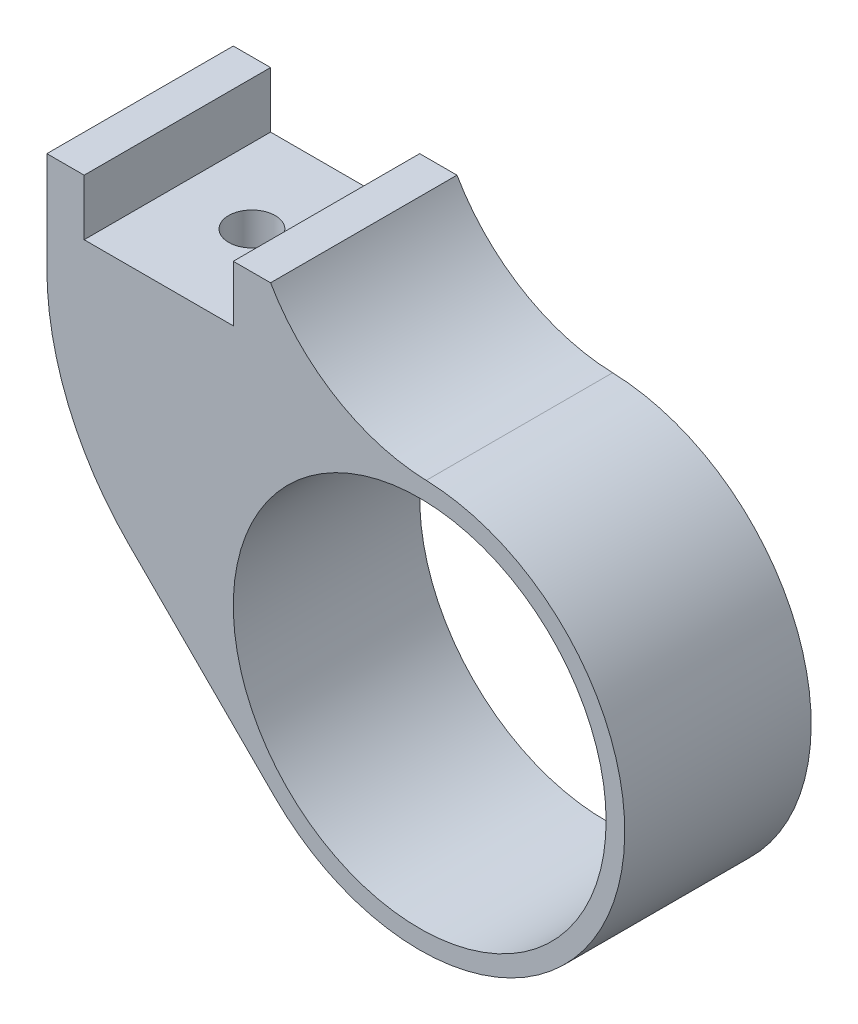
ISO-10303-21;
HEADER;
FILE_DESCRIPTION(('STEP AP214'),'2;1');
FILE_NAME('part.step','',(''),(''),'','','');
FILE_SCHEMA(('AUTOMOTIVE_DESIGN { 1 0 10303 214 1 1 1 1 }'));
ENDSEC;
DATA;
#1=APPLICATION_CONTEXT('core data for automotive mechanical design processes');
#2=APPLICATION_PROTOCOL_DEFINITION('international standard','automotive_design',2000,#1);
#3=PRODUCT_CONTEXT('',#1,'mechanical');
#4=PRODUCT('Part','Part','',(#3));
#5=PRODUCT_RELATED_PRODUCT_CATEGORY('part','',(#4));
#6=PRODUCT_DEFINITION_FORMATION('','',#4);
#7=PRODUCT_DEFINITION_CONTEXT('part definition',#1,'design');
#8=PRODUCT_DEFINITION('design','',#6,#7);
#9=PRODUCT_DEFINITION_SHAPE('','',#8);
#10=(LENGTH_UNIT() NAMED_UNIT(*) SI_UNIT(.MILLI.,.METRE.));
#11=(NAMED_UNIT(*) PLANE_ANGLE_UNIT() SI_UNIT($,.RADIAN.));
#12=(NAMED_UNIT(*) SI_UNIT($,.STERADIAN.) SOLID_ANGLE_UNIT());
#13=UNCERTAINTY_MEASURE_WITH_UNIT(LENGTH_MEASURE(1.E-05),#10,'distance_accuracy_value','');
#14=(GEOMETRIC_REPRESENTATION_CONTEXT(3) GLOBAL_UNCERTAINTY_ASSIGNED_CONTEXT((#13)) GLOBAL_UNIT_ASSIGNED_CONTEXT((#10,
#11,#12)) REPRESENTATION_CONTEXT('',''));
#15=CARTESIAN_POINT('',(0.,0.,0.));
#16=DIRECTION('',(0.,0.,1.));
#17=DIRECTION('',(1.,0.,0.));
#18=AXIS2_PLACEMENT_3D('',#15,#16,#17);
#19=CARTESIAN_POINT('',(0.,13.,10.));
#20=DIRECTION('',(0.,-1.,0.));
#21=DIRECTION('',(1.,0.,0.));
#22=AXIS2_PLACEMENT_3D('',#19,#20,#21);
#23=PLANE('',#22);
#24=DIRECTION('',(-1.,0.,0.));
#25=VECTOR('',#24,1.);
#26=CARTESIAN_POINT('',(0.,13.,0.));
#27=LINE('',#26,#25);
#28=CARTESIAN_POINT('',(-10.,13.,0.));
#29=VERTEX_POINT('',#28);
#30=CARTESIAN_POINT('',(-18.,13.,0.));
#31=VERTEX_POINT('',#30);
#32=EDGE_CURVE('E178',#29,#31,#27,.T.);
#33=ORIENTED_EDGE('',*,*,#32,.T.);
#34=DIRECTION('',(0.,0.,-1.));
#35=VECTOR('',#34,1.);
#36=CARTESIAN_POINT('',(-18.,13.,10.));
#37=LINE('',#36,#35);
#38=CARTESIAN_POINT('',(-18.,13.,10.));
#39=VERTEX_POINT('',#38);
#40=EDGE_CURVE('E191',#39,#31,#37,.T.);
#41=ORIENTED_EDGE('',*,*,#40,.F.);
#42=DIRECTION('',(-1.,0.,0.));
#43=VECTOR('',#42,1.);
#44=CARTESIAN_POINT('',(0.,13.,10.));
#45=LINE('',#44,#43);
#46=CARTESIAN_POINT('',(-10.,13.,10.));
#47=VERTEX_POINT('',#46);
#48=EDGE_CURVE('E156',#47,#39,#45,.T.);
#49=ORIENTED_EDGE('',*,*,#48,.F.);
#50=DIRECTION('',(0.,0.,-1.));
#51=VECTOR('',#50,1.);
#52=CARTESIAN_POINT('',(-10.,13.,10.));
#53=LINE('',#52,#51);
#54=EDGE_CURVE('E193',#47,#29,#53,.T.);
#55=ORIENTED_EDGE('',*,*,#54,.T.);
#56=EDGE_LOOP('',(#33,#41,#49,#55));
#57=FACE_BOUND('',#56,.T.);
#58=CARTESIAN_POINT('',(-14.,13.,5.));
#59=DIRECTION('',(0.,1.,0.));
#60=DIRECTION('',(0.,0.,1.));
#61=AXIS2_PLACEMENT_3D('',#58,#59,#60);
#62=CIRCLE('',#61,1.25);
#63=CARTESIAN_POINT('',(-14.,13.,6.25));
#64=VERTEX_POINT('',#63);
#65=EDGE_CURVE('E367',#64,#64,#62,.T.);
#66=ORIENTED_EDGE('',*,*,#65,.F.);
#67=EDGE_LOOP('',(#66));
#68=FACE_BOUND('',#67,.T.);
#69=ADVANCED_FACE('F41',(#57,#68),#23,.F.);
#70=CARTESIAN_POINT('',(-7.77817459305206,-7.77817459305198,10.));
#71=DIRECTION('',(-0.707106781186551,-0.707106781186544,0.));
#72=DIRECTION('',(0.707106781186544,-0.707106781186551,0.));
#73=AXIS2_PLACEMENT_3D('',#70,#71,#72);
#74=PLANE('',#73);
#75=CARTESIAN_POINT('',(-14.,-1.55634918610398,5.));
#76=DIRECTION('',(-0.707106781186551,-0.707106781186544,0.));
#77=DIRECTION('',(-0.707106781186544,0.707106781186551,0.));
#78=AXIS2_PLACEMENT_3D('',#75,#76,#77);
#79=ELLIPSE('',#78,1.76776695296637,1.25);
#80=CARTESIAN_POINT('',(-15.25,-0.306349186103969,5.));
#81=VERTEX_POINT('',#80);
#82=EDGE_CURVE('E149',#81,#81,#79,.T.);
#83=ORIENTED_EDGE('',*,*,#82,.F.);
#84=EDGE_LOOP('',(#83));
#85=FACE_BOUND('',#84,.T.);
#86=DIRECTION('',(-0.707106781186544,0.707106781186551,0.));
#87=VECTOR('',#86,1.);
#88=CARTESIAN_POINT('',(-7.77817459305206,-7.77817459305198,10.));
#89=LINE('',#88,#87);
#90=CARTESIAN_POINT('',(-7.77817459305206,-7.77817459305198,10.));
#91=VERTEX_POINT('',#90);
#92=CARTESIAN_POINT('',(-15.6066017177983,0.0502525316943081,10.));
#93=VERTEX_POINT('',#92);
#94=EDGE_CURVE('E123',#91,#93,#89,.T.);
#95=ORIENTED_EDGE('',*,*,#94,.T.);
#96=DIRECTION('',(0.,0.,-1.));
#97=VECTOR('',#96,1.);
#98=CARTESIAN_POINT('',(-15.6066017177983,0.0502525316943055,0.));
#99=LINE('',#98,#97);
#100=CARTESIAN_POINT('',(-15.6066017177983,0.0502525316943081,0.));
#101=VERTEX_POINT('',#100);
#102=EDGE_CURVE('E205',#93,#101,#99,.T.);
#103=ORIENTED_EDGE('',*,*,#102,.T.);
#104=DIRECTION('',(-0.707106781186544,0.707106781186551,0.));
#105=VECTOR('',#104,1.);
#106=CARTESIAN_POINT('',(-7.77817459305206,-7.77817459305198,0.));
#107=LINE('',#106,#105);
#108=CARTESIAN_POINT('',(-7.77817459305206,-7.77817459305198,0.));
#109=VERTEX_POINT('',#108);
#110=EDGE_CURVE('E125',#109,#101,#107,.T.);
#111=ORIENTED_EDGE('',*,*,#110,.F.);
#112=DIRECTION('',(0.,0.,-1.));
#113=VECTOR('',#112,1.);
#114=CARTESIAN_POINT('',(-7.77817459305206,-7.77817459305198,10.));
#115=LINE('',#114,#113);
#116=EDGE_CURVE('E118',#91,#109,#115,.T.);
#117=ORIENTED_EDGE('',*,*,#116,.F.);
#118=EDGE_LOOP('',(#95,#103,#111,#117));
#119=FACE_BOUND('',#118,.T.);
#120=ADVANCED_FACE('F120',(#85,#119),#74,.T.);
#121=CARTESIAN_POINT('',(0.,0.,10.));
#122=DIRECTION('',(0.,0.,-1.));
#123=DIRECTION('',(-1.,0.,0.));
#124=AXIS2_PLACEMENT_3D('',#121,#122,#123);
#125=CYLINDRICAL_SURFACE('',#124,11.);
#126=CARTESIAN_POINT('',(0.,0.,0.));
#127=DIRECTION('',(0.,0.,1.));
#128=DIRECTION('',(1.,0.,0.));
#129=AXIS2_PLACEMENT_3D('',#126,#127,#128);
#130=CIRCLE('',#129,11.);
#131=CARTESIAN_POINT('',(0.349040848052191,10.9944609002166,0.));
#132=VERTEX_POINT('',#131);
#133=EDGE_CURVE('E171',#109,#132,#130,.T.);
#134=ORIENTED_EDGE('',*,*,#133,.T.);
#135=DIRECTION('',(0.,0.,-1.));
#136=VECTOR('',#135,1.);
#137=CARTESIAN_POINT('',(0.349040848052191,10.9944609002166,10.));
#138=LINE('',#137,#136);
#139=CARTESIAN_POINT('',(0.349040848052191,10.9944609002166,10.));
#140=VERTEX_POINT('',#139);
#141=EDGE_CURVE('E129',#132,#140,#138,.F.);
#142=ORIENTED_EDGE('',*,*,#141,.T.);
#143=CARTESIAN_POINT('',(0.,0.,10.));
#144=DIRECTION('',(0.,0.,1.));
#145=DIRECTION('',(1.,0.,0.));
#146=AXIS2_PLACEMENT_3D('',#143,#144,#145);
#147=CIRCLE('',#146,11.);
#148=EDGE_CURVE('E133',#91,#140,#147,.T.);
#149=ORIENTED_EDGE('',*,*,#148,.F.);
#150=ORIENTED_EDGE('',*,*,#116,.T.);
#151=EDGE_LOOP('',(#134,#142,#149,#150));
#152=FACE_BOUND('',#151,.T.);
#153=ADVANCED_FACE('F134',(#152),#125,.T.);
#154=CARTESIAN_POINT('',(0.,16.,10.));
#155=DIRECTION('',(0.,1.,0.));
#156=DIRECTION('',(0.,0.,1.));
#157=AXIS2_PLACEMENT_3D('',#154,#155,#156);
#158=PLANE('',#157);
#159=DIRECTION('',(1.,0.,0.));
#160=VECTOR('',#159,1.);
#161=CARTESIAN_POINT('',(0.,16.,0.));
#162=LINE('',#161,#160);
#163=CARTESIAN_POINT('',(-10.,16.,0.));
#164=VERTEX_POINT('',#163);
#165=CARTESIAN_POINT('',(-8.,16.,0.));
#166=VERTEX_POINT('',#165);
#167=EDGE_CURVE('E173',#164,#166,#162,.T.);
#168=ORIENTED_EDGE('',*,*,#167,.F.);
#169=DIRECTION('',(0.,0.,-1.));
#170=VECTOR('',#169,1.);
#171=CARTESIAN_POINT('',(-10.,16.,10.));
#172=LINE('',#171,#170);
#173=CARTESIAN_POINT('',(-10.,16.,10.));
#174=VERTEX_POINT('',#173);
#175=EDGE_CURVE('E196',#174,#164,#172,.T.);
#176=ORIENTED_EDGE('',*,*,#175,.F.);
#177=DIRECTION('',(1.,0.,0.));
#178=VECTOR('',#177,1.);
#179=CARTESIAN_POINT('',(0.,16.,10.));
#180=LINE('',#179,#178);
#181=CARTESIAN_POINT('',(-8.,16.,10.));
#182=VERTEX_POINT('',#181);
#183=EDGE_CURVE('E138',#174,#182,#180,.T.);
#184=ORIENTED_EDGE('',*,*,#183,.T.);
#185=DIRECTION('',(0.,0.,-1.));
#186=VECTOR('',#185,1.);
#187=CARTESIAN_POINT('',(-8.,16.,10.));
#188=LINE('',#187,#186);
#189=EDGE_CURVE('E130',#182,#166,#188,.T.);
#190=ORIENTED_EDGE('',*,*,#189,.T.);
#191=EDGE_LOOP('',(#168,#176,#184,#190));
#192=FACE_BOUND('',#191,.T.);
#193=ADVANCED_FACE('F216',(#192),#158,.T.);
#194=CARTESIAN_POINT('',(-10.,0.,10.));
#195=DIRECTION('',(1.,0.,0.));
#196=DIRECTION('',(0.,0.,-1.));
#197=AXIS2_PLACEMENT_3D('',#194,#195,#196);
#198=PLANE('',#197);
#199=DIRECTION('',(0.,-1.,0.));
#200=VECTOR('',#199,1.);
#201=CARTESIAN_POINT('',(-10.,0.,0.));
#202=LINE('',#201,#200);
#203=EDGE_CURVE('E176',#164,#29,#202,.T.);
#204=ORIENTED_EDGE('',*,*,#203,.T.);
#205=ORIENTED_EDGE('',*,*,#54,.F.);
#206=DIRECTION('',(0.,-1.,0.));
#207=VECTOR('',#206,1.);
#208=CARTESIAN_POINT('',(-10.,0.,10.));
#209=LINE('',#208,#207);
#210=EDGE_CURVE('E154',#174,#47,#209,.T.);
#211=ORIENTED_EDGE('',*,*,#210,.F.);
#212=ORIENTED_EDGE('',*,*,#175,.T.);
#213=EDGE_LOOP('',(#204,#205,#211,#212));
#214=FACE_BOUND('',#213,.T.);
#215=ADVANCED_FACE('F221',(#214),#198,.F.);
#216=CARTESIAN_POINT('',(-18.,0.,10.));
#217=DIRECTION('',(1.,0.,0.));
#218=DIRECTION('',(0.,0.,-1.));
#219=AXIS2_PLACEMENT_3D('',#216,#217,#218);
#220=PLANE('',#219);
#221=DIRECTION('',(0.,-1.,0.));
#222=VECTOR('',#221,1.);
#223=CARTESIAN_POINT('',(-18.,0.,0.));
#224=LINE('',#223,#222);
#225=CARTESIAN_POINT('',(-18.,16.,0.));
#226=VERTEX_POINT('',#225);
#227=EDGE_CURVE('E181',#226,#31,#224,.T.);
#228=ORIENTED_EDGE('',*,*,#227,.F.);
#229=DIRECTION('',(0.,0.,-1.));
#230=VECTOR('',#229,1.);
#231=CARTESIAN_POINT('',(-18.,16.,10.));
#232=LINE('',#231,#230);
#233=CARTESIAN_POINT('',(-18.,16.,10.));
#234=VERTEX_POINT('',#233);
#235=EDGE_CURVE('E189',#234,#226,#232,.T.);
#236=ORIENTED_EDGE('',*,*,#235,.F.);
#237=DIRECTION('',(0.,-1.,0.));
#238=VECTOR('',#237,1.);
#239=CARTESIAN_POINT('',(-18.,0.,10.));
#240=LINE('',#239,#238);
#241=EDGE_CURVE('E158',#234,#39,#240,.T.);
#242=ORIENTED_EDGE('',*,*,#241,.T.);
#243=ORIENTED_EDGE('',*,*,#40,.T.);
#244=EDGE_LOOP('',(#228,#236,#242,#243));
#245=FACE_BOUND('',#244,.T.);
#246=ADVANCED_FACE('F231',(#245),#220,.T.);
#247=CARTESIAN_POINT('',(0.,16.,10.));
#248=DIRECTION('',(0.,1.,0.));
#249=DIRECTION('',(0.,0.,1.));
#250=AXIS2_PLACEMENT_3D('',#247,#248,#249);
#251=PLANE('',#250);
#252=DIRECTION('',(1.,0.,0.));
#253=VECTOR('',#252,1.);
#254=CARTESIAN_POINT('',(0.,16.,0.));
#255=LINE('',#254,#253);
#256=CARTESIAN_POINT('',(-20.,16.,0.));
#257=VERTEX_POINT('',#256);
#258=EDGE_CURVE('E184',#257,#226,#255,.T.);
#259=ORIENTED_EDGE('',*,*,#258,.F.);
#260=DIRECTION('',(0.,0.,-1.));
#261=VECTOR('',#260,1.);
#262=CARTESIAN_POINT('',(-20.,16.,10.));
#263=LINE('',#262,#261);
#264=CARTESIAN_POINT('',(-20.,16.,10.));
#265=VERTEX_POINT('',#264);
#266=EDGE_CURVE('E169',#265,#257,#263,.T.);
#267=ORIENTED_EDGE('',*,*,#266,.F.);
#268=DIRECTION('',(1.,0.,0.));
#269=VECTOR('',#268,1.);
#270=CARTESIAN_POINT('',(0.,16.,10.));
#271=LINE('',#270,#269);
#272=EDGE_CURVE('E161',#265,#234,#271,.T.);
#273=ORIENTED_EDGE('',*,*,#272,.T.);
#274=ORIENTED_EDGE('',*,*,#235,.T.);
#275=EDGE_LOOP('',(#259,#267,#273,#274));
#276=FACE_BOUND('',#275,.T.);
#277=ADVANCED_FACE('F234',(#276),#251,.T.);
#278=CARTESIAN_POINT('',(-20.,0.,10.));
#279=DIRECTION('',(1.,0.,0.));
#280=DIRECTION('',(0.,0.,-1.));
#281=AXIS2_PLACEMENT_3D('',#278,#279,#280);
#282=PLANE('',#281);
#283=DIRECTION('',(0.,-1.,0.));
#284=VECTOR('',#283,1.);
#285=CARTESIAN_POINT('',(-20.,0.,0.));
#286=LINE('',#285,#284);
#287=CARTESIAN_POINT('',(-20.,10.6568542494925,0.));
#288=VERTEX_POINT('',#287);
#289=EDGE_CURVE('E146',#257,#288,#286,.T.);
#290=ORIENTED_EDGE('',*,*,#289,.T.);
#291=DIRECTION('',(0.,0.,-1.));
#292=VECTOR('',#291,1.);
#293=CARTESIAN_POINT('',(-20.,10.6568542494925,10.));
#294=LINE('',#293,#292);
#295=CARTESIAN_POINT('',(-20.,10.6568542494925,10.));
#296=VERTEX_POINT('',#295);
#297=EDGE_CURVE('E49',#288,#296,#294,.F.);
#298=ORIENTED_EDGE('',*,*,#297,.T.);
#299=DIRECTION('',(0.,-1.,0.));
#300=VECTOR('',#299,1.);
#301=CARTESIAN_POINT('',(-20.,0.,10.));
#302=LINE('',#301,#300);
#303=EDGE_CURVE('E164',#265,#296,#302,.T.);
#304=ORIENTED_EDGE('',*,*,#303,.F.);
#305=ORIENTED_EDGE('',*,*,#266,.T.);
#306=EDGE_LOOP('',(#290,#298,#304,#305));
#307=FACE_BOUND('',#306,.T.);
#308=ADVANCED_FACE('F270',(#307),#282,.F.);
#309=CARTESIAN_POINT('',(0.,0.,10.));
#310=DIRECTION('',(0.,0.,-1.));
#311=DIRECTION('',(-1.,0.,0.));
#312=AXIS2_PLACEMENT_3D('',#309,#310,#311);
#313=CYLINDRICAL_SURFACE('',#312,10.);
#314=CARTESIAN_POINT('',(0.,0.,10.));
#315=DIRECTION('',(0.,0.,1.));
#316=DIRECTION('',(1.,0.,0.));
#317=AXIS2_PLACEMENT_3D('',#314,#315,#316);
#318=CIRCLE('',#317,10.);
#319=CARTESIAN_POINT('',(10.,0.,10.));
#320=VERTEX_POINT('',#319);
#321=EDGE_CURVE('E166',#320,#320,#318,.T.);
#322=ORIENTED_EDGE('',*,*,#321,.T.);
#323=EDGE_LOOP('',(#322));
#324=FACE_BOUND('',#323,.T.);
#325=CARTESIAN_POINT('',(0.,0.,0.));
#326=DIRECTION('',(0.,0.,1.));
#327=DIRECTION('',(1.,0.,0.));
#328=AXIS2_PLACEMENT_3D('',#325,#326,#327);
#329=CIRCLE('',#328,10.);
#330=CARTESIAN_POINT('',(10.,0.,0.));
#331=VERTEX_POINT('',#330);
#332=EDGE_CURVE('E143',#331,#331,#329,.T.);
#333=ORIENTED_EDGE('',*,*,#332,.F.);
#334=EDGE_LOOP('',(#333));
#335=FACE_BOUND('',#334,.T.);
#336=ADVANCED_FACE('F265',(#324,#335),#313,.F.);
#337=CARTESIAN_POINT('',(0.,0.,10.));
#338=DIRECTION('',(0.,0.,1.));
#339=DIRECTION('',(1.,0.,0.));
#340=AXIS2_PLACEMENT_3D('',#337,#338,#339);
#341=PLANE('',#340);
#342=ORIENTED_EDGE('',*,*,#303,.T.);
#343=CARTESIAN_POINT('',(-5.,10.6568542494925,10.));
#344=DIRECTION('',(0.,0.,1.));
#345=DIRECTION('',(1.,0.,0.));
#346=AXIS2_PLACEMENT_3D('',#343,#344,#345);
#347=CIRCLE('',#346,15.);
#348=EDGE_CURVE('E11',#296,#93,#347,.T.);
#349=ORIENTED_EDGE('',*,*,#348,.T.);
#350=ORIENTED_EDGE('',*,*,#94,.F.);
#351=ORIENTED_EDGE('',*,*,#148,.T.);
#352=CARTESIAN_POINT('',(0.666350709917819,20.9894253549589,10.));
#353=DIRECTION('',(0.,0.,1.));
#354=DIRECTION('',(1.,0.,0.));
#355=AXIS2_PLACEMENT_3D('',#352,#353,#354);
#356=CIRCLE('',#355,10.);
#357=EDGE_CURVE('E203',#140,#182,#356,.F.);
#358=ORIENTED_EDGE('',*,*,#357,.T.);
#359=ORIENTED_EDGE('',*,*,#183,.F.);
#360=ORIENTED_EDGE('',*,*,#210,.T.);
#361=ORIENTED_EDGE('',*,*,#48,.T.);
#362=ORIENTED_EDGE('',*,*,#241,.F.);
#363=ORIENTED_EDGE('',*,*,#272,.F.);
#364=EDGE_LOOP('',(#342,#349,#350,#351,#358,#359,#360,#361,#362,#363));
#365=FACE_BOUND('',#364,.T.);
#366=ORIENTED_EDGE('',*,*,#321,.F.);
#367=EDGE_LOOP('',(#366));
#368=FACE_BOUND('',#367,.T.);
#369=ADVANCED_FACE('F140',(#365,#368),#341,.T.);
#370=CARTESIAN_POINT('',(0.,0.,0.));
#371=DIRECTION('',(0.,0.,1.));
#372=DIRECTION('',(1.,0.,0.));
#373=AXIS2_PLACEMENT_3D('',#370,#371,#372);
#374=PLANE('',#373);
#375=ORIENTED_EDGE('',*,*,#110,.T.);
#376=CARTESIAN_POINT('',(-5.,10.6568542494925,0.));
#377=DIRECTION('',(0.,0.,1.));
#378=DIRECTION('',(1.,0.,0.));
#379=AXIS2_PLACEMENT_3D('',#376,#377,#378);
#380=CIRCLE('',#379,15.);
#381=EDGE_CURVE('E63',#101,#288,#380,.F.);
#382=ORIENTED_EDGE('',*,*,#381,.T.);
#383=ORIENTED_EDGE('',*,*,#289,.F.);
#384=ORIENTED_EDGE('',*,*,#258,.T.);
#385=ORIENTED_EDGE('',*,*,#227,.T.);
#386=ORIENTED_EDGE('',*,*,#32,.F.);
#387=ORIENTED_EDGE('',*,*,#203,.F.);
#388=ORIENTED_EDGE('',*,*,#167,.T.);
#389=CARTESIAN_POINT('',(0.666350709917819,20.9894253549589,0.));
#390=DIRECTION('',(0.,0.,1.));
#391=DIRECTION('',(1.,0.,0.));
#392=AXIS2_PLACEMENT_3D('',#389,#390,#391);
#393=CIRCLE('',#392,10.);
#394=EDGE_CURVE('E201',#166,#132,#393,.T.);
#395=ORIENTED_EDGE('',*,*,#394,.T.);
#396=ORIENTED_EDGE('',*,*,#133,.F.);
#397=EDGE_LOOP('',(#375,#382,#383,#384,#385,#386,#387,#388,#395,#396));
#398=FACE_BOUND('',#397,.T.);
#399=ORIENTED_EDGE('',*,*,#332,.T.);
#400=EDGE_LOOP('',(#399));
#401=FACE_BOUND('',#400,.T.);
#402=ADVANCED_FACE('F208',(#398,#401),#374,.F.);
#403=CARTESIAN_POINT('',(0.666350709917819,20.9894253549589,10.));
#404=DIRECTION('',(0.,0.,1.));
#405=DIRECTION('',(1.,0.,0.));
#406=AXIS2_PLACEMENT_3D('',#403,#404,#405);
#407=CYLINDRICAL_SURFACE('',#406,10.);
#408=ORIENTED_EDGE('',*,*,#357,.F.);
#409=ORIENTED_EDGE('',*,*,#141,.F.);
#410=ORIENTED_EDGE('',*,*,#394,.F.);
#411=ORIENTED_EDGE('',*,*,#189,.F.);
#412=EDGE_LOOP('',(#408,#409,#410,#411));
#413=FACE_BOUND('',#412,.T.);
#414=ADVANCED_FACE('F211',(#413),#407,.F.);
#415=CARTESIAN_POINT('',(-14.,13.,5.));
#416=DIRECTION('',(0.,1.,0.));
#417=DIRECTION('',(0.,0.,1.));
#418=AXIS2_PLACEMENT_3D('',#415,#416,#417);
#419=CYLINDRICAL_SURFACE('',#418,1.25);
#420=ORIENTED_EDGE('',*,*,#65,.T.);
#421=EDGE_LOOP('',(#420));
#422=FACE_BOUND('',#421,.T.);
#423=ORIENTED_EDGE('',*,*,#82,.T.);
#424=EDGE_LOOP('',(#423));
#425=FACE_BOUND('',#424,.T.);
#426=ADVANCED_FACE('F236',(#422,#425),#419,.F.);
#427=CARTESIAN_POINT('',(-5.,10.6568542494925,10.));
#428=DIRECTION('',(0.,0.,1.));
#429=DIRECTION('',(1.,0.,0.));
#430=AXIS2_PLACEMENT_3D('',#427,#428,#429);
#431=CYLINDRICAL_SURFACE('',#430,15.);
#432=ORIENTED_EDGE('',*,*,#348,.F.);
#433=ORIENTED_EDGE('',*,*,#297,.F.);
#434=ORIENTED_EDGE('',*,*,#381,.F.);
#435=ORIENTED_EDGE('',*,*,#102,.F.);
#436=EDGE_LOOP('',(#432,#433,#434,#435));
#437=FACE_BOUND('',#436,.T.);
#438=ADVANCED_FACE('F43',(#437),#431,.T.);
#439=CLOSED_SHELL('',(#69,#120,#153,#193,#215,#246,#277,#308,#336,#369,#402,#414,#426,#438));
#440=MANIFOLD_SOLID_BREP('B2',#439);
#441=ADVANCED_BREP_SHAPE_REPRESENTATION('',(#18,#440),#14);
#442=SHAPE_DEFINITION_REPRESENTATION(#9,#441);
ENDSEC;
END-ISO-10303-21;
